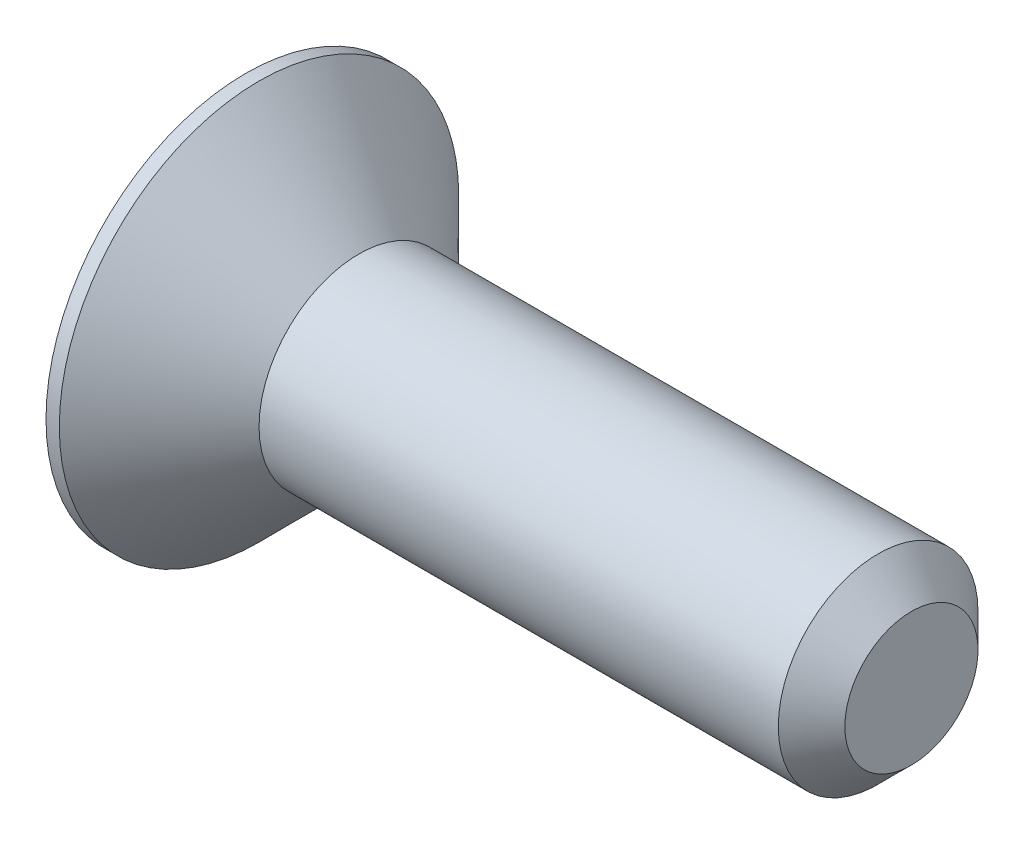
ISO-10303-21;
HEADER;
FILE_DESCRIPTION(('STEP AP214'),'2;1');
FILE_NAME('part.step','',(''),(''),'','','');
FILE_SCHEMA(('AUTOMOTIVE_DESIGN { 1 0 10303 214 1 1 1 1 }'));
ENDSEC;
DATA;
#1=APPLICATION_CONTEXT('core data for automotive mechanical design processes');
#2=APPLICATION_PROTOCOL_DEFINITION('international standard','automotive_design',2000,#1);
#3=PRODUCT_CONTEXT('',#1,'mechanical');
#4=PRODUCT('Part','Part','',(#3));
#5=PRODUCT_RELATED_PRODUCT_CATEGORY('part','',(#4));
#6=PRODUCT_DEFINITION_FORMATION('','',#4);
#7=PRODUCT_DEFINITION_CONTEXT('part definition',#1,'design');
#8=PRODUCT_DEFINITION('design','',#6,#7);
#9=PRODUCT_DEFINITION_SHAPE('','',#8);
#10=(LENGTH_UNIT() NAMED_UNIT(*) SI_UNIT(.MILLI.,.METRE.));
#11=(NAMED_UNIT(*) PLANE_ANGLE_UNIT() SI_UNIT($,.RADIAN.));
#12=(NAMED_UNIT(*) SI_UNIT($,.STERADIAN.) SOLID_ANGLE_UNIT());
#13=UNCERTAINTY_MEASURE_WITH_UNIT(LENGTH_MEASURE(1.E-05),#10,'distance_accuracy_value','');
#14=(GEOMETRIC_REPRESENTATION_CONTEXT(3) GLOBAL_UNCERTAINTY_ASSIGNED_CONTEXT((#13)) GLOBAL_UNIT_ASSIGNED_CONTEXT((#10,
#11,#12)) REPRESENTATION_CONTEXT('',''));
#15=CARTESIAN_POINT('',(0.,0.,0.));
#16=DIRECTION('',(0.,0.,1.));
#17=DIRECTION('',(1.,0.,0.));
#18=AXIS2_PLACEMENT_3D('',#15,#16,#17);
#19=CARTESIAN_POINT('',(-1.7,-3.,0.));
#20=DIRECTION('',(-1.,0.,0.));
#21=DIRECTION('',(0.,0.,1.));
#22=AXIS2_PLACEMENT_3D('',#19,#20,#21);
#23=PLANE('',#22);
#24=DIRECTION('',(0.,0.5,-0.866025403784439));
#25=VECTOR('',#24,1.);
#26=CARTESIAN_POINT('',(-1.7,0.577350269189627,0.999999999999999));
#27=LINE('',#26,#25);
#28=CARTESIAN_POINT('',(-1.7,0.577350269189627,0.999999999999999));
#29=VERTEX_POINT('',#28);
#30=CARTESIAN_POINT('',(-1.7,1.15470053837925,0.));
#31=VERTEX_POINT('',#30);
#32=EDGE_CURVE('E61',#29,#31,#27,.T.);
#33=ORIENTED_EDGE('',*,*,#32,.F.);
#34=DIRECTION('',(0.,1.,0.));
#35=VECTOR('',#34,1.);
#36=CARTESIAN_POINT('',(-1.7,-0.577350269189626,0.999999999999999));
#37=LINE('',#36,#35);
#38=CARTESIAN_POINT('',(-1.7,-0.577350269189626,0.999999999999999));
#39=VERTEX_POINT('',#38);
#40=EDGE_CURVE('E155',#39,#29,#37,.T.);
#41=ORIENTED_EDGE('',*,*,#40,.F.);
#42=DIRECTION('',(0.,0.5,0.866025403784439));
#43=VECTOR('',#42,1.);
#44=CARTESIAN_POINT('',(-1.7,-1.15470053837925,0.));
#45=LINE('',#44,#43);
#46=CARTESIAN_POINT('',(-1.7,-1.15470053837925,0.));
#47=VERTEX_POINT('',#46);
#48=EDGE_CURVE('E152',#47,#39,#45,.T.);
#49=ORIENTED_EDGE('',*,*,#48,.F.);
#50=DIRECTION('',(0.,-0.5,0.866025403784438));
#51=VECTOR('',#50,1.);
#52=CARTESIAN_POINT('',(-1.7,-0.577350269189626,-1.));
#53=LINE('',#52,#51);
#54=CARTESIAN_POINT('',(-1.7,-0.577350269189626,-1.));
#55=VERTEX_POINT('',#54);
#56=EDGE_CURVE('E109',#55,#47,#53,.T.);
#57=ORIENTED_EDGE('',*,*,#56,.F.);
#58=DIRECTION('',(0.,-1.,0.));
#59=VECTOR('',#58,1.);
#60=CARTESIAN_POINT('',(-1.7,0.577350269189626,-1.));
#61=LINE('',#60,#59);
#62=CARTESIAN_POINT('',(-1.7,0.577350269189626,-1.));
#63=VERTEX_POINT('',#62);
#64=EDGE_CURVE('E146',#63,#55,#61,.T.);
#65=ORIENTED_EDGE('',*,*,#64,.F.);
#66=DIRECTION('',(0.,-0.5,-0.866025403784439));
#67=VECTOR('',#66,1.);
#68=CARTESIAN_POINT('',(-1.7,1.15470053837925,0.));
#69=LINE('',#68,#67);
#70=EDGE_CURVE('E142',#31,#63,#69,.T.);
#71=ORIENTED_EDGE('',*,*,#70,.F.);
#72=EDGE_LOOP('',(#33,#41,#49,#57,#65,#71));
#73=FACE_BOUND('',#72,.T.);
#74=CARTESIAN_POINT('',(-1.7,0.,0.));
#75=DIRECTION('',(-1.,0.,0.));
#76=DIRECTION('',(0.,0.,1.));
#77=AXIS2_PLACEMENT_3D('',#74,#75,#76);
#78=CIRCLE('',#77,3.);
#79=CARTESIAN_POINT('',(-1.7,0.,3.));
#80=VERTEX_POINT('',#79);
#81=EDGE_CURVE('E11',#80,#80,#78,.T.);
#82=ORIENTED_EDGE('',*,*,#81,.T.);
#83=EDGE_LOOP('',(#82));
#84=FACE_BOUND('',#83,.T.);
#85=ADVANCED_FACE('F46',(#73,#84),#23,.T.);
#86=CARTESIAN_POINT('',(-1.7,0.,0.));
#87=DIRECTION('',(-1.,0.,0.));
#88=DIRECTION('',(0.,0.,1.));
#89=AXIS2_PLACEMENT_3D('',#86,#87,#88);
#90=CYLINDRICAL_SURFACE('',#89,3.);
#91=CARTESIAN_POINT('',(-1.5,0.,0.));
#92=DIRECTION('',(-1.,0.,0.));
#93=DIRECTION('',(0.,0.,1.));
#94=AXIS2_PLACEMENT_3D('',#91,#92,#93);
#95=CIRCLE('',#94,3.);
#96=CARTESIAN_POINT('',(-1.5,0.,3.));
#97=VERTEX_POINT('',#96);
#98=EDGE_CURVE('E54',#97,#97,#95,.T.);
#99=ORIENTED_EDGE('',*,*,#98,.T.);
#100=EDGE_LOOP('',(#99));
#101=FACE_BOUND('',#100,.T.);
#102=ORIENTED_EDGE('',*,*,#81,.F.);
#103=EDGE_LOOP('',(#102));
#104=FACE_BOUND('',#103,.T.);
#105=ADVANCED_FACE('F186',(#101,#104),#90,.T.);
#106=CARTESIAN_POINT('',(-1.5,0.,0.));
#107=DIRECTION('',(-1.,0.,0.));
#108=DIRECTION('',(0.,0.,1.));
#109=AXIS2_PLACEMENT_3D('',#106,#107,#108);
#110=CONICAL_SURFACE('',#109,3.,0.785398163397448);
#111=CARTESIAN_POINT('',(0.,0.,0.));
#112=DIRECTION('',(-1.,0.,0.));
#113=DIRECTION('',(0.,0.,1.));
#114=AXIS2_PLACEMENT_3D('',#111,#112,#113);
#115=CIRCLE('',#114,1.5);
#116=CARTESIAN_POINT('',(0.,0.,1.5));
#117=VERTEX_POINT('',#116);
#118=EDGE_CURVE('E178',#117,#117,#115,.T.);
#119=ORIENTED_EDGE('',*,*,#118,.T.);
#120=EDGE_LOOP('',(#119));
#121=FACE_BOUND('',#120,.T.);
#122=ORIENTED_EDGE('',*,*,#98,.F.);
#123=EDGE_LOOP('',(#122));
#124=FACE_BOUND('',#123,.T.);
#125=ADVANCED_FACE('F189',(#121,#124),#110,.T.);
#126=CARTESIAN_POINT('',(-1.7,0.,0.));
#127=DIRECTION('',(-1.,0.,0.));
#128=DIRECTION('',(0.,0.,1.));
#129=AXIS2_PLACEMENT_3D('',#126,#127,#128);
#130=CYLINDRICAL_SURFACE('',#129,1.5);
#131=CARTESIAN_POINT('',(7.8,0.,0.));
#132=DIRECTION('',(-1.,0.,0.));
#133=DIRECTION('',(0.,0.,1.));
#134=AXIS2_PLACEMENT_3D('',#131,#132,#133);
#135=CIRCLE('',#134,1.5);
#136=CARTESIAN_POINT('',(7.8,0.,1.5));
#137=VERTEX_POINT('',#136);
#138=EDGE_CURVE('E174',#137,#137,#135,.T.);
#139=ORIENTED_EDGE('',*,*,#138,.T.);
#140=EDGE_LOOP('',(#139));
#141=FACE_BOUND('',#140,.T.);
#142=ORIENTED_EDGE('',*,*,#118,.F.);
#143=EDGE_LOOP('',(#142));
#144=FACE_BOUND('',#143,.T.);
#145=ADVANCED_FACE('F191',(#141,#144),#130,.T.);
#146=CARTESIAN_POINT('',(7.8,0.,0.));
#147=DIRECTION('',(-1.,0.,0.));
#148=DIRECTION('',(0.,0.,1.));
#149=AXIS2_PLACEMENT_3D('',#146,#147,#148);
#150=CONICAL_SURFACE('',#149,1.5,0.785398163397445);
#151=CARTESIAN_POINT('',(8.3,0.,0.));
#152=DIRECTION('',(-1.,0.,0.));
#153=DIRECTION('',(0.,0.,1.));
#154=AXIS2_PLACEMENT_3D('',#151,#152,#153);
#155=CIRCLE('',#154,1.);
#156=CARTESIAN_POINT('',(8.3,0.,1.));
#157=VERTEX_POINT('',#156);
#158=EDGE_CURVE('E161',#157,#157,#155,.T.);
#159=ORIENTED_EDGE('',*,*,#158,.T.);
#160=EDGE_LOOP('',(#159));
#161=FACE_BOUND('',#160,.T.);
#162=ORIENTED_EDGE('',*,*,#138,.F.);
#163=EDGE_LOOP('',(#162));
#164=FACE_BOUND('',#163,.T.);
#165=ADVANCED_FACE('F198',(#161,#164),#150,.T.);
#166=CARTESIAN_POINT('',(8.3,-1.,0.));
#167=DIRECTION('',(1.,0.,0.));
#168=DIRECTION('',(0.,0.,-1.));
#169=AXIS2_PLACEMENT_3D('',#166,#167,#168);
#170=PLANE('',#169);
#171=ORIENTED_EDGE('',*,*,#158,.F.);
#172=EDGE_LOOP('',(#171));
#173=FACE_BOUND('',#172,.T.);
#174=ADVANCED_FACE('F227',(#173),#170,.T.);
#175=CARTESIAN_POINT('',(-0.6,0.577350269189627,0.999999999999999));
#176=DIRECTION('',(0.,0.866025403784438,0.5));
#177=DIRECTION('',(0.,-0.5,0.866025403784439));
#178=AXIS2_PLACEMENT_3D('',#175,#176,#177);
#179=PLANE('',#178);
#180=ORIENTED_EDGE('',*,*,#32,.T.);
#181=DIRECTION('',(-1.,0.,0.));
#182=VECTOR('',#181,1.);
#183=CARTESIAN_POINT('',(-0.6,1.15470053837925,0.));
#184=LINE('',#183,#182);
#185=CARTESIAN_POINT('',(-0.6,1.15470053837925,0.));
#186=VERTEX_POINT('',#185);
#187=EDGE_CURVE('E91',#186,#31,#184,.T.);
#188=ORIENTED_EDGE('',*,*,#187,.F.);
#189=DIRECTION('',(0.,0.5,-0.866025403784439));
#190=VECTOR('',#189,1.);
#191=CARTESIAN_POINT('',(-0.6,0.577350269189627,0.999999999999999));
#192=LINE('',#191,#190);
#193=CARTESIAN_POINT('',(-0.6,0.577350269189627,0.999999999999999));
#194=VERTEX_POINT('',#193);
#195=EDGE_CURVE('E158',#194,#186,#192,.T.);
#196=ORIENTED_EDGE('',*,*,#195,.F.);
#197=DIRECTION('',(-1.,0.,0.));
#198=VECTOR('',#197,1.);
#199=CARTESIAN_POINT('',(-0.6,0.577350269189627,0.999999999999999));
#200=LINE('',#199,#198);
#201=EDGE_CURVE('E69',#194,#29,#200,.T.);
#202=ORIENTED_EDGE('',*,*,#201,.T.);
#203=EDGE_LOOP('',(#180,#188,#196,#202));
#204=FACE_BOUND('',#203,.T.);
#205=ADVANCED_FACE('F224',(#204),#179,.F.);
#206=CARTESIAN_POINT('',(-0.6,-0.577350269189626,0.999999999999999));
#207=DIRECTION('',(0.,0.,1.));
#208=DIRECTION('',(1.,0.,0.));
#209=AXIS2_PLACEMENT_3D('',#206,#207,#208);
#210=PLANE('',#209);
#211=ORIENTED_EDGE('',*,*,#40,.T.);
#212=ORIENTED_EDGE('',*,*,#201,.F.);
#213=DIRECTION('',(0.,1.,0.));
#214=VECTOR('',#213,1.);
#215=CARTESIAN_POINT('',(-0.6,-0.577350269189626,0.999999999999999));
#216=LINE('',#215,#214);
#217=CARTESIAN_POINT('',(-0.6,-0.577350269189626,0.999999999999999));
#218=VERTEX_POINT('',#217);
#219=EDGE_CURVE('E123',#218,#194,#216,.T.);
#220=ORIENTED_EDGE('',*,*,#219,.F.);
#221=DIRECTION('',(-1.,0.,0.));
#222=VECTOR('',#221,1.);
#223=CARTESIAN_POINT('',(-0.6,-0.577350269189626,0.999999999999999));
#224=LINE('',#223,#222);
#225=EDGE_CURVE('E114',#218,#39,#224,.T.);
#226=ORIENTED_EDGE('',*,*,#225,.T.);
#227=EDGE_LOOP('',(#211,#212,#220,#226));
#228=FACE_BOUND('',#227,.T.);
#229=ADVANCED_FACE('F226',(#228),#210,.F.);
#230=CARTESIAN_POINT('',(-0.6,-1.15470053837925,0.));
#231=DIRECTION('',(0.,-0.866025403784439,0.5));
#232=DIRECTION('',(0.,-0.5,-0.866025403784439));
#233=AXIS2_PLACEMENT_3D('',#230,#231,#232);
#234=PLANE('',#233);
#235=ORIENTED_EDGE('',*,*,#48,.T.);
#236=ORIENTED_EDGE('',*,*,#225,.F.);
#237=DIRECTION('',(0.,0.5,0.866025403784439));
#238=VECTOR('',#237,1.);
#239=CARTESIAN_POINT('',(-0.6,-1.15470053837925,0.));
#240=LINE('',#239,#238);
#241=CARTESIAN_POINT('',(-0.6,-1.15470053837925,0.));
#242=VERTEX_POINT('',#241);
#243=EDGE_CURVE('E118',#242,#218,#240,.T.);
#244=ORIENTED_EDGE('',*,*,#243,.F.);
#245=DIRECTION('',(-1.,0.,0.));
#246=VECTOR('',#245,1.);
#247=CARTESIAN_POINT('',(-0.6,-1.15470053837925,0.));
#248=LINE('',#247,#246);
#249=EDGE_CURVE('E102',#242,#47,#248,.T.);
#250=ORIENTED_EDGE('',*,*,#249,.T.);
#251=EDGE_LOOP('',(#235,#236,#244,#250));
#252=FACE_BOUND('',#251,.T.);
#253=ADVANCED_FACE('F119',(#252),#234,.F.);
#254=CARTESIAN_POINT('',(-0.6,-0.577350269189626,-1.));
#255=DIRECTION('',(0.,-0.866025403784438,-0.5));
#256=DIRECTION('',(0.,0.5,-0.866025403784439));
#257=AXIS2_PLACEMENT_3D('',#254,#255,#256);
#258=PLANE('',#257);
#259=ORIENTED_EDGE('',*,*,#56,.T.);
#260=ORIENTED_EDGE('',*,*,#249,.F.);
#261=DIRECTION('',(0.,-0.5,0.866025403784438));
#262=VECTOR('',#261,1.);
#263=CARTESIAN_POINT('',(-0.6,-0.577350269189626,-1.));
#264=LINE('',#263,#262);
#265=CARTESIAN_POINT('',(-0.6,-0.577350269189626,-1.));
#266=VERTEX_POINT('',#265);
#267=EDGE_CURVE('E106',#266,#242,#264,.T.);
#268=ORIENTED_EDGE('',*,*,#267,.F.);
#269=DIRECTION('',(-1.,0.,0.));
#270=VECTOR('',#269,1.);
#271=CARTESIAN_POINT('',(-0.6,-0.577350269189626,-1.));
#272=LINE('',#271,#270);
#273=EDGE_CURVE('E115',#266,#55,#272,.T.);
#274=ORIENTED_EDGE('',*,*,#273,.T.);
#275=EDGE_LOOP('',(#259,#260,#268,#274));
#276=FACE_BOUND('',#275,.T.);
#277=ADVANCED_FACE('F104',(#276),#258,.F.);
#278=CARTESIAN_POINT('',(-0.6,0.577350269189626,-1.));
#279=DIRECTION('',(0.,0.,-1.));
#280=DIRECTION('',(-1.,0.,0.));
#281=AXIS2_PLACEMENT_3D('',#278,#279,#280);
#282=PLANE('',#281);
#283=ORIENTED_EDGE('',*,*,#64,.T.);
#284=ORIENTED_EDGE('',*,*,#273,.F.);
#285=DIRECTION('',(0.,-1.,0.));
#286=VECTOR('',#285,1.);
#287=CARTESIAN_POINT('',(-0.6,0.577350269189626,-1.));
#288=LINE('',#287,#286);
#289=CARTESIAN_POINT('',(-0.6,0.577350269189626,-1.));
#290=VERTEX_POINT('',#289);
#291=EDGE_CURVE('E129',#290,#266,#288,.T.);
#292=ORIENTED_EDGE('',*,*,#291,.F.);
#293=DIRECTION('',(-1.,0.,0.));
#294=VECTOR('',#293,1.);
#295=CARTESIAN_POINT('',(-0.6,0.577350269189626,-1.));
#296=LINE('',#295,#294);
#297=EDGE_CURVE('E166',#290,#63,#296,.T.);
#298=ORIENTED_EDGE('',*,*,#297,.T.);
#299=EDGE_LOOP('',(#283,#284,#292,#298));
#300=FACE_BOUND('',#299,.T.);
#301=ADVANCED_FACE('F271',(#300),#282,.F.);
#302=CARTESIAN_POINT('',(-0.6,1.15470053837925,0.));
#303=DIRECTION('',(0.,0.866025403784439,-0.5));
#304=DIRECTION('',(0.,0.5,0.866025403784439));
#305=AXIS2_PLACEMENT_3D('',#302,#303,#304);
#306=PLANE('',#305);
#307=ORIENTED_EDGE('',*,*,#70,.T.);
#308=ORIENTED_EDGE('',*,*,#297,.F.);
#309=DIRECTION('',(0.,-0.5,-0.866025403784439));
#310=VECTOR('',#309,1.);
#311=CARTESIAN_POINT('',(-0.6,1.15470053837925,0.));
#312=LINE('',#311,#310);
#313=EDGE_CURVE('E134',#186,#290,#312,.T.);
#314=ORIENTED_EDGE('',*,*,#313,.F.);
#315=ORIENTED_EDGE('',*,*,#187,.T.);
#316=EDGE_LOOP('',(#307,#308,#314,#315));
#317=FACE_BOUND('',#316,.T.);
#318=ADVANCED_FACE('F211',(#317),#306,.F.);
#319=CARTESIAN_POINT('',(-0.6,0.,0.));
#320=DIRECTION('',(-1.,0.,0.));
#321=DIRECTION('',(0.,0.,1.));
#322=AXIS2_PLACEMENT_3D('',#319,#320,#321);
#323=PLANE('',#322);
#324=ORIENTED_EDGE('',*,*,#195,.T.);
#325=ORIENTED_EDGE('',*,*,#313,.T.);
#326=ORIENTED_EDGE('',*,*,#291,.T.);
#327=ORIENTED_EDGE('',*,*,#267,.T.);
#328=ORIENTED_EDGE('',*,*,#243,.T.);
#329=ORIENTED_EDGE('',*,*,#219,.T.);
#330=EDGE_LOOP('',(#324,#325,#326,#327,#328,#329));
#331=FACE_BOUND('',#330,.T.);
#332=ADVANCED_FACE('F126',(#331),#323,.T.);
#333=CLOSED_SHELL('',(#85,#105,#125,#145,#165,#174,#205,#229,#253,#277,#301,#318,#332));
#334=MANIFOLD_SOLID_BREP('B2',#333);
#335=ADVANCED_BREP_SHAPE_REPRESENTATION('',(#18,#334),#14);
#336=SHAPE_DEFINITION_REPRESENTATION(#9,#335);
ENDSEC;
END-ISO-10303-21;
